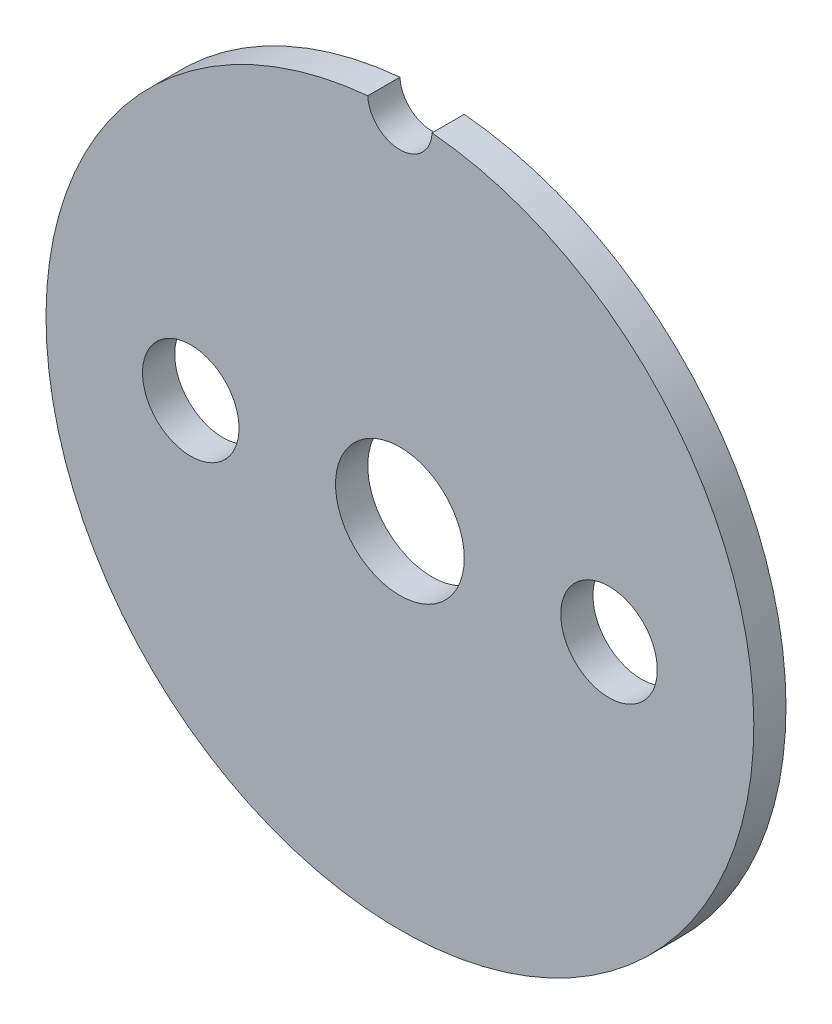
ISO-10303-21;
HEADER;
FILE_DESCRIPTION(('STEP AP214'),'2;1');
FILE_NAME('part.step','',(''),(''),'','','');
FILE_SCHEMA(('AUTOMOTIVE_DESIGN { 1 0 10303 214 1 1 1 1 }'));
ENDSEC;
DATA;
#1=APPLICATION_CONTEXT('core data for automotive mechanical design processes');
#2=APPLICATION_PROTOCOL_DEFINITION('international standard','automotive_design',2000,#1);
#3=PRODUCT_CONTEXT('',#1,'mechanical');
#4=PRODUCT('Part','Part','',(#3));
#5=PRODUCT_RELATED_PRODUCT_CATEGORY('part','',(#4));
#6=PRODUCT_DEFINITION_FORMATION('','',#4);
#7=PRODUCT_DEFINITION_CONTEXT('part definition',#1,'design');
#8=PRODUCT_DEFINITION('design','',#6,#7);
#9=PRODUCT_DEFINITION_SHAPE('','',#8);
#10=(LENGTH_UNIT() NAMED_UNIT(*) SI_UNIT(.MILLI.,.METRE.));
#11=(NAMED_UNIT(*) PLANE_ANGLE_UNIT() SI_UNIT($,.RADIAN.));
#12=(NAMED_UNIT(*) SI_UNIT($,.STERADIAN.) SOLID_ANGLE_UNIT());
#13=UNCERTAINTY_MEASURE_WITH_UNIT(LENGTH_MEASURE(1.E-05),#10,'distance_accuracy_value','');
#14=(GEOMETRIC_REPRESENTATION_CONTEXT(3) GLOBAL_UNCERTAINTY_ASSIGNED_CONTEXT((#13)) GLOBAL_UNIT_ASSIGNED_CONTEXT((#10,
#11,#12)) REPRESENTATION_CONTEXT('',''));
#15=CARTESIAN_POINT('',(0.,0.,0.));
#16=DIRECTION('',(0.,0.,1.));
#17=DIRECTION('',(1.,0.,0.));
#18=AXIS2_PLACEMENT_3D('',#15,#16,#17);
#19=CARTESIAN_POINT('',(0.783567134268554,-3.89178356713428,1.));
#20=DIRECTION('',(0.,0.,1.));
#21=DIRECTION('',(1.,0.,0.));
#22=AXIS2_PLACEMENT_3D('',#19,#20,#21);
#23=PLANE('',#22);
#24=CARTESIAN_POINT('',(0.783567134268554,7.10821643286572,1.));
#25=DIRECTION('',(0.,0.,1.));
#26=DIRECTION('',(1.,0.,0.));
#27=AXIS2_PLACEMENT_3D('',#24,#25,#26);
#28=CIRCLE('',#27,1.);
#29=CARTESIAN_POINT('',(-0.215399273723988,7.06276188741118,1.));
#30=VERTEX_POINT('',#29);
#31=CARTESIAN_POINT('',(1.7825335422611,7.06276188741118,1.));
#32=VERTEX_POINT('',#31);
#33=EDGE_CURVE('E63',#30,#32,#28,.T.);
#34=ORIENTED_EDGE('',*,*,#33,.F.);
#35=CARTESIAN_POINT('',(0.783567134268554,-3.89178356713428,1.));
#36=DIRECTION('',(0.,0.,1.));
#37=DIRECTION('',(1.,0.,0.));
#38=AXIS2_PLACEMENT_3D('',#35,#36,#37);
#39=CIRCLE('',#38,11.);
#40=EDGE_CURVE('E69',#30,#32,#39,.T.);
#41=ORIENTED_EDGE('',*,*,#40,.T.);
#42=EDGE_LOOP('',(#34,#41));
#43=FACE_BOUND('',#42,.T.);
#44=CARTESIAN_POINT('',(7.28356713426855,-3.89178356713428,1.));
#45=DIRECTION('',(0.,0.,1.));
#46=DIRECTION('',(-1.,0.,0.));
#47=AXIS2_PLACEMENT_3D('',#44,#45,#46);
#48=CIRCLE('',#47,1.5);
#49=CARTESIAN_POINT('',(5.78356713426855,-3.89178356713428,1.));
#50=VERTEX_POINT('',#49);
#51=EDGE_CURVE('E86',#50,#50,#48,.T.);
#52=ORIENTED_EDGE('',*,*,#51,.F.);
#53=EDGE_LOOP('',(#52));
#54=FACE_BOUND('',#53,.T.);
#55=CARTESIAN_POINT('',(-5.71643286573145,-3.89178356713428,1.));
#56=DIRECTION('',(0.,0.,1.));
#57=DIRECTION('',(1.,0.,0.));
#58=AXIS2_PLACEMENT_3D('',#55,#56,#57);
#59=CIRCLE('',#58,1.5);
#60=CARTESIAN_POINT('',(-4.21643286573145,-3.89178356713428,1.));
#61=VERTEX_POINT('',#60);
#62=EDGE_CURVE('E79',#61,#61,#59,.T.);
#63=ORIENTED_EDGE('',*,*,#62,.F.);
#64=EDGE_LOOP('',(#63));
#65=FACE_BOUND('',#64,.T.);
#66=CARTESIAN_POINT('',(0.783567134268554,-3.89178356713428,1.));
#67=DIRECTION('',(0.,0.,1.));
#68=DIRECTION('',(1.,0.,0.));
#69=AXIS2_PLACEMENT_3D('',#66,#67,#68);
#70=CIRCLE('',#69,2.);
#71=CARTESIAN_POINT('',(2.78356713426855,-3.89178356713428,1.));
#72=VERTEX_POINT('',#71);
#73=EDGE_CURVE('E94',#72,#72,#70,.T.);
#74=ORIENTED_EDGE('',*,*,#73,.F.);
#75=EDGE_LOOP('',(#74));
#76=FACE_BOUND('',#75,.T.);
#77=ADVANCED_FACE('F38',(#43,#54,#65,#76),#23,.T.);
#78=CARTESIAN_POINT('',(0.783567134268554,-3.89178356713428,0.));
#79=DIRECTION('',(0.,0.,1.));
#80=DIRECTION('',(1.,0.,0.));
#81=AXIS2_PLACEMENT_3D('',#78,#79,#80);
#82=PLANE('',#81);
#83=CARTESIAN_POINT('',(0.783567134268554,-3.89178356713428,0.));
#84=DIRECTION('',(0.,0.,1.));
#85=DIRECTION('',(1.,0.,0.));
#86=AXIS2_PLACEMENT_3D('',#83,#84,#85);
#87=CIRCLE('',#86,11.);
#88=CARTESIAN_POINT('',(-0.215399273723987,7.06276188741118,0.));
#89=VERTEX_POINT('',#88);
#90=CARTESIAN_POINT('',(1.78253354226111,7.06276188741118,0.));
#91=VERTEX_POINT('',#90);
#92=EDGE_CURVE('E76',#89,#91,#87,.T.);
#93=ORIENTED_EDGE('',*,*,#92,.F.);
#94=CARTESIAN_POINT('',(0.783567134268554,7.10821643286572,0.));
#95=DIRECTION('',(0.,0.,1.));
#96=DIRECTION('',(1.,0.,0.));
#97=AXIS2_PLACEMENT_3D('',#94,#95,#96);
#98=CIRCLE('',#97,1.);
#99=EDGE_CURVE('E54',#89,#91,#98,.T.);
#100=ORIENTED_EDGE('',*,*,#99,.T.);
#101=EDGE_LOOP('',(#93,#100));
#102=FACE_BOUND('',#101,.T.);
#103=CARTESIAN_POINT('',(-5.71643286573145,-3.89178356713428,0.));
#104=DIRECTION('',(0.,0.,1.));
#105=DIRECTION('',(1.,0.,0.));
#106=AXIS2_PLACEMENT_3D('',#103,#104,#105);
#107=CIRCLE('',#106,1.5);
#108=CARTESIAN_POINT('',(-4.21643286573145,-3.89178356713428,0.));
#109=VERTEX_POINT('',#108);
#110=EDGE_CURVE('E82',#109,#109,#107,.T.);
#111=ORIENTED_EDGE('',*,*,#110,.T.);
#112=EDGE_LOOP('',(#111));
#113=FACE_BOUND('',#112,.T.);
#114=CARTESIAN_POINT('',(7.28356713426855,-3.89178356713428,0.));
#115=DIRECTION('',(0.,0.,1.));
#116=DIRECTION('',(-1.,0.,0.));
#117=AXIS2_PLACEMENT_3D('',#114,#115,#116);
#118=CIRCLE('',#117,1.5);
#119=CARTESIAN_POINT('',(5.78356713426855,-3.89178356713428,0.));
#120=VERTEX_POINT('',#119);
#121=EDGE_CURVE('E90',#120,#120,#118,.T.);
#122=ORIENTED_EDGE('',*,*,#121,.T.);
#123=EDGE_LOOP('',(#122));
#124=FACE_BOUND('',#123,.T.);
#125=CARTESIAN_POINT('',(0.783567134268554,-3.89178356713428,0.));
#126=DIRECTION('',(0.,0.,1.));
#127=DIRECTION('',(1.,0.,0.));
#128=AXIS2_PLACEMENT_3D('',#125,#126,#127);
#129=CIRCLE('',#128,2.);
#130=CARTESIAN_POINT('',(2.78356713426855,-3.89178356713428,0.));
#131=VERTEX_POINT('',#130);
#132=EDGE_CURVE('E98',#131,#131,#129,.T.);
#133=ORIENTED_EDGE('',*,*,#132,.T.);
#134=EDGE_LOOP('',(#133));
#135=FACE_BOUND('',#134,.T.);
#136=ADVANCED_FACE('F107',(#102,#113,#124,#135),#82,.F.);
#137=CARTESIAN_POINT('',(0.783567134268554,-3.89178356713428,1.));
#138=DIRECTION('',(0.,0.,-1.));
#139=DIRECTION('',(-1.,0.,0.));
#140=AXIS2_PLACEMENT_3D('',#137,#138,#139);
#141=CYLINDRICAL_SURFACE('',#140,11.);
#142=ORIENTED_EDGE('',*,*,#92,.T.);
#143=DIRECTION('',(0.,0.,1.));
#144=VECTOR('',#143,1.);
#145=CARTESIAN_POINT('',(1.7825335422611,7.06276188741118,-4.));
#146=LINE('',#145,#144);
#147=EDGE_CURVE('E11',#91,#32,#146,.T.);
#148=ORIENTED_EDGE('',*,*,#147,.T.);
#149=ORIENTED_EDGE('',*,*,#40,.F.);
#150=DIRECTION('',(0.,0.,1.));
#151=VECTOR('',#150,1.);
#152=CARTESIAN_POINT('',(-0.215399273723988,7.06276188741118,-4.));
#153=LINE('',#152,#151);
#154=EDGE_CURVE('E47',#30,#89,#153,.F.);
#155=ORIENTED_EDGE('',*,*,#154,.T.);
#156=EDGE_LOOP('',(#142,#148,#149,#155));
#157=FACE_BOUND('',#156,.T.);
#158=ADVANCED_FACE('F40',(#157),#141,.T.);
#159=CARTESIAN_POINT('',(-5.71643286573145,-3.89178356713428,1.));
#160=DIRECTION('',(0.,0.,-1.));
#161=DIRECTION('',(-1.,0.,0.));
#162=AXIS2_PLACEMENT_3D('',#159,#160,#161);
#163=CYLINDRICAL_SURFACE('',#162,1.5);
#164=ORIENTED_EDGE('',*,*,#62,.T.);
#165=EDGE_LOOP('',(#164));
#166=FACE_BOUND('',#165,.T.);
#167=ORIENTED_EDGE('',*,*,#110,.F.);
#168=EDGE_LOOP('',(#167));
#169=FACE_BOUND('',#168,.T.);
#170=ADVANCED_FACE('F126',(#166,#169),#163,.F.);
#171=CARTESIAN_POINT('',(7.28356713426855,-3.89178356713428,1.));
#172=DIRECTION('',(0.,0.,-1.));
#173=DIRECTION('',(-1.,0.,0.));
#174=AXIS2_PLACEMENT_3D('',#171,#172,#173);
#175=CYLINDRICAL_SURFACE('',#174,1.5);
#176=ORIENTED_EDGE('',*,*,#51,.T.);
#177=EDGE_LOOP('',(#176));
#178=FACE_BOUND('',#177,.T.);
#179=ORIENTED_EDGE('',*,*,#121,.F.);
#180=EDGE_LOOP('',(#179));
#181=FACE_BOUND('',#180,.T.);
#182=ADVANCED_FACE('F118',(#178,#181),#175,.F.);
#183=CARTESIAN_POINT('',(0.783567134268554,-3.89178356713428,1.));
#184=DIRECTION('',(0.,0.,-1.));
#185=DIRECTION('',(-1.,0.,0.));
#186=AXIS2_PLACEMENT_3D('',#183,#184,#185);
#187=CYLINDRICAL_SURFACE('',#186,2.);
#188=ORIENTED_EDGE('',*,*,#73,.T.);
#189=EDGE_LOOP('',(#188));
#190=FACE_BOUND('',#189,.T.);
#191=ORIENTED_EDGE('',*,*,#132,.F.);
#192=EDGE_LOOP('',(#191));
#193=FACE_BOUND('',#192,.T.);
#194=ADVANCED_FACE('F116',(#190,#193),#187,.F.);
#195=CARTESIAN_POINT('',(0.783567134268554,7.10821643286572,-9.));
#196=DIRECTION('',(0.,0.,1.));
#197=DIRECTION('',(1.,0.,0.));
#198=AXIS2_PLACEMENT_3D('',#195,#196,#197);
#199=CYLINDRICAL_SURFACE('',#198,1.);
#200=ORIENTED_EDGE('',*,*,#99,.F.);
#201=ORIENTED_EDGE('',*,*,#154,.F.);
#202=ORIENTED_EDGE('',*,*,#33,.T.);
#203=ORIENTED_EDGE('',*,*,#147,.F.);
#204=EDGE_LOOP('',(#200,#201,#202,#203));
#205=FACE_BOUND('',#204,.T.);
#206=ADVANCED_FACE('F62',(#205),#199,.F.);
#207=CLOSED_SHELL('',(#77,#136,#158,#170,#182,#194,#206));
#208=MANIFOLD_SOLID_BREP('B2',#207);
#209=ADVANCED_BREP_SHAPE_REPRESENTATION('',(#18,#208),#14);
#210=SHAPE_DEFINITION_REPRESENTATION(#9,#209);
ENDSEC;
END-ISO-10303-21;
